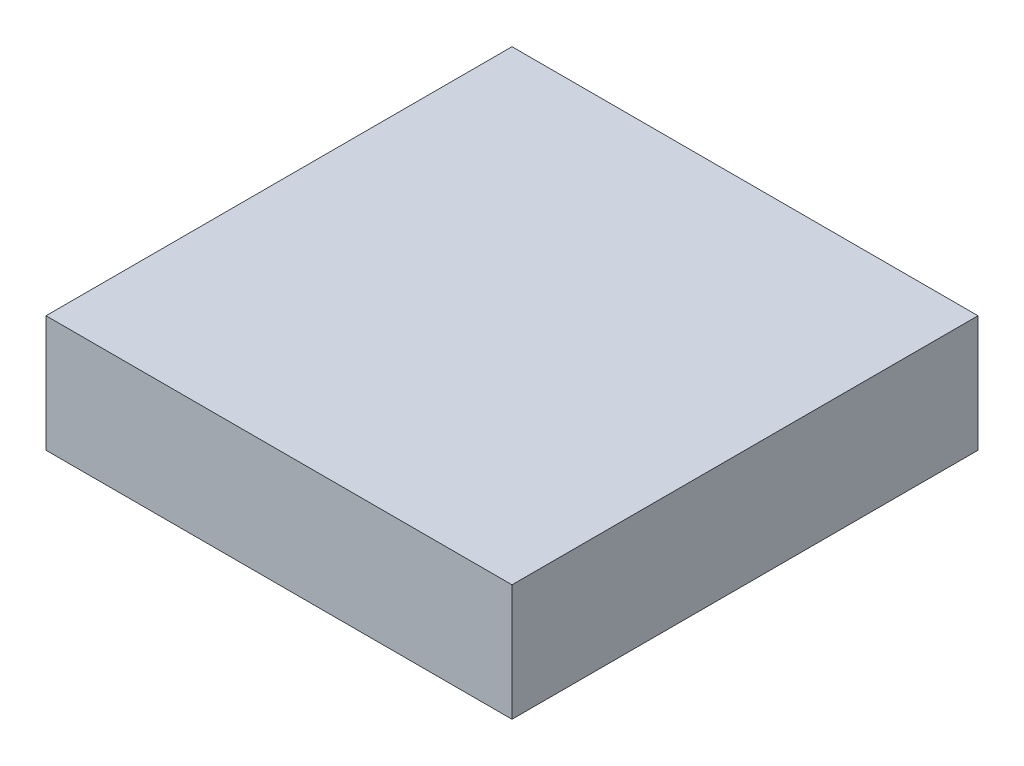
ISO-10303-21;
HEADER;
FILE_DESCRIPTION(('STEP AP214'),'2;1');
FILE_NAME('part.step','',(''),(''),'','','');
FILE_SCHEMA(('AUTOMOTIVE_DESIGN { 1 0 10303 214 1 1 1 1 }'));
ENDSEC;
DATA;
#1=APPLICATION_CONTEXT('core data for automotive mechanical design processes');
#2=APPLICATION_PROTOCOL_DEFINITION('international standard','automotive_design',2000,#1);
#3=PRODUCT_CONTEXT('',#1,'mechanical');
#4=PRODUCT('Part','Part','',(#3));
#5=PRODUCT_RELATED_PRODUCT_CATEGORY('part','',(#4));
#6=PRODUCT_DEFINITION_FORMATION('','',#4);
#7=PRODUCT_DEFINITION_CONTEXT('part definition',#1,'design');
#8=PRODUCT_DEFINITION('design','',#6,#7);
#9=PRODUCT_DEFINITION_SHAPE('','',#8);
#10=(LENGTH_UNIT() NAMED_UNIT(*) SI_UNIT(.MILLI.,.METRE.));
#11=(NAMED_UNIT(*) PLANE_ANGLE_UNIT() SI_UNIT($,.RADIAN.));
#12=(NAMED_UNIT(*) SI_UNIT($,.STERADIAN.) SOLID_ANGLE_UNIT());
#13=UNCERTAINTY_MEASURE_WITH_UNIT(LENGTH_MEASURE(1.E-05),#10,'distance_accuracy_value','');
#14=(GEOMETRIC_REPRESENTATION_CONTEXT(3) GLOBAL_UNCERTAINTY_ASSIGNED_CONTEXT((#13)) GLOBAL_UNIT_ASSIGNED_CONTEXT((#10,
#11,#12)) REPRESENTATION_CONTEXT('',''));
#15=CARTESIAN_POINT('',(0.,0.,0.));
#16=DIRECTION('',(0.,0.,1.));
#17=DIRECTION('',(1.,0.,0.));
#18=AXIS2_PLACEMENT_3D('',#15,#16,#17);
#19=CARTESIAN_POINT('',(0.,10.,0.));
#20=DIRECTION('',(1.,0.,0.));
#21=DIRECTION('',(0.,0.,-1.));
#22=AXIS2_PLACEMENT_3D('',#19,#20,#21);
#23=PLANE('',#22);
#24=DIRECTION('',(0.,0.,1.));
#25=VECTOR('',#24,1.);
#26=CARTESIAN_POINT('',(0.,0.,0.));
#27=LINE('',#26,#25);
#28=CARTESIAN_POINT('',(0.,0.,-40.));
#29=VERTEX_POINT('',#28);
#30=CARTESIAN_POINT('',(0.,0.,0.));
#31=VERTEX_POINT('',#30);
#32=EDGE_CURVE('E121',#29,#31,#27,.T.);
#33=ORIENTED_EDGE('',*,*,#32,.T.);
#34=DIRECTION('',(0.,-1.,0.));
#35=VECTOR('',#34,1.);
#36=CARTESIAN_POINT('',(0.,10.,0.));
#37=LINE('',#36,#35);
#38=CARTESIAN_POINT('',(0.,10.,0.));
#39=VERTEX_POINT('',#38);
#40=EDGE_CURVE('E11',#39,#31,#37,.T.);
#41=ORIENTED_EDGE('',*,*,#40,.F.);
#42=DIRECTION('',(0.,0.,1.));
#43=VECTOR('',#42,1.);
#44=CARTESIAN_POINT('',(0.,10.,0.));
#45=LINE('',#44,#43);
#46=CARTESIAN_POINT('',(0.,10.,-40.));
#47=VERTEX_POINT('',#46);
#48=EDGE_CURVE('E135',#47,#39,#45,.T.);
#49=ORIENTED_EDGE('',*,*,#48,.F.);
#50=DIRECTION('',(0.,-1.,0.));
#51=VECTOR('',#50,1.);
#52=CARTESIAN_POINT('',(0.,10.,-40.));
#53=LINE('',#52,#51);
#54=EDGE_CURVE('E141',#47,#29,#53,.T.);
#55=ORIENTED_EDGE('',*,*,#54,.T.);
#56=EDGE_LOOP('',(#33,#41,#49,#55));
#57=FACE_BOUND('',#56,.T.);
#58=ADVANCED_FACE('F39',(#57),#23,.F.);
#59=CARTESIAN_POINT('',(0.,10.,0.));
#60=DIRECTION('',(0.,0.,-1.));
#61=DIRECTION('',(-1.,0.,0.));
#62=AXIS2_PLACEMENT_3D('',#59,#60,#61);
#63=PLANE('',#62);
#64=DIRECTION('',(1.,0.,0.));
#65=VECTOR('',#64,1.);
#66=CARTESIAN_POINT('',(0.,0.,0.));
#67=LINE('',#66,#65);
#68=CARTESIAN_POINT('',(40.,0.,0.));
#69=VERTEX_POINT('',#68);
#70=EDGE_CURVE('E128',#31,#69,#67,.T.);
#71=ORIENTED_EDGE('',*,*,#70,.T.);
#72=DIRECTION('',(0.,-1.,0.));
#73=VECTOR('',#72,1.);
#74=CARTESIAN_POINT('',(40.,10.,0.));
#75=LINE('',#74,#73);
#76=CARTESIAN_POINT('',(40.,10.,0.));
#77=VERTEX_POINT('',#76);
#78=EDGE_CURVE('E46',#77,#69,#75,.T.);
#79=ORIENTED_EDGE('',*,*,#78,.F.);
#80=DIRECTION('',(1.,0.,0.));
#81=VECTOR('',#80,1.);
#82=CARTESIAN_POINT('',(0.,10.,0.));
#83=LINE('',#82,#81);
#84=EDGE_CURVE('E134',#39,#77,#83,.T.);
#85=ORIENTED_EDGE('',*,*,#84,.F.);
#86=ORIENTED_EDGE('',*,*,#40,.T.);
#87=EDGE_LOOP('',(#71,#79,#85,#86));
#88=FACE_BOUND('',#87,.T.);
#89=ADVANCED_FACE('F175',(#88),#63,.F.);
#90=CARTESIAN_POINT('',(40.,10.,0.));
#91=DIRECTION('',(-1.,0.,0.));
#92=DIRECTION('',(0.,0.,1.));
#93=AXIS2_PLACEMENT_3D('',#90,#91,#92);
#94=PLANE('',#93);
#95=DIRECTION('',(0.,0.,-1.));
#96=VECTOR('',#95,1.);
#97=CARTESIAN_POINT('',(40.,0.,0.));
#98=LINE('',#97,#96);
#99=CARTESIAN_POINT('',(40.,0.,-40.));
#100=VERTEX_POINT('',#99);
#101=EDGE_CURVE('E143',#69,#100,#98,.T.);
#102=ORIENTED_EDGE('',*,*,#101,.T.);
#103=DIRECTION('',(0.,-1.,0.));
#104=VECTOR('',#103,1.);
#105=CARTESIAN_POINT('',(40.,10.,-40.));
#106=LINE('',#105,#104);
#107=CARTESIAN_POINT('',(40.,10.,-40.));
#108=VERTEX_POINT('',#107);
#109=EDGE_CURVE('E146',#108,#100,#106,.T.);
#110=ORIENTED_EDGE('',*,*,#109,.F.);
#111=DIRECTION('',(0.,0.,-1.));
#112=VECTOR('',#111,1.);
#113=CARTESIAN_POINT('',(40.,10.,0.));
#114=LINE('',#113,#112);
#115=EDGE_CURVE('E138',#77,#108,#114,.T.);
#116=ORIENTED_EDGE('',*,*,#115,.F.);
#117=ORIENTED_EDGE('',*,*,#78,.T.);
#118=EDGE_LOOP('',(#102,#110,#116,#117));
#119=FACE_BOUND('',#118,.T.);
#120=ADVANCED_FACE('F157',(#119),#94,.F.);
#121=CARTESIAN_POINT('',(0.,10.,-40.));
#122=DIRECTION('',(0.,0.,1.));
#123=DIRECTION('',(1.,0.,0.));
#124=AXIS2_PLACEMENT_3D('',#121,#122,#123);
#125=PLANE('',#124);
#126=DIRECTION('',(-1.,0.,0.));
#127=VECTOR('',#126,1.);
#128=CARTESIAN_POINT('',(0.,0.,-40.));
#129=LINE('',#128,#127);
#130=EDGE_CURVE('E136',#100,#29,#129,.T.);
#131=ORIENTED_EDGE('',*,*,#130,.T.);
#132=ORIENTED_EDGE('',*,*,#54,.F.);
#133=DIRECTION('',(-1.,0.,0.));
#134=VECTOR('',#133,1.);
#135=CARTESIAN_POINT('',(0.,10.,-40.));
#136=LINE('',#135,#134);
#137=EDGE_CURVE('E139',#108,#47,#136,.T.);
#138=ORIENTED_EDGE('',*,*,#137,.F.);
#139=ORIENTED_EDGE('',*,*,#109,.T.);
#140=EDGE_LOOP('',(#131,#132,#138,#139));
#141=FACE_BOUND('',#140,.T.);
#142=ADVANCED_FACE('F163',(#141),#125,.F.);
#143=CARTESIAN_POINT('',(0.,10.,0.));
#144=DIRECTION('',(0.,-1.,0.));
#145=DIRECTION('',(0.,0.,-1.));
#146=AXIS2_PLACEMENT_3D('',#143,#144,#145);
#147=PLANE('',#146);
#148=ORIENTED_EDGE('',*,*,#48,.T.);
#149=ORIENTED_EDGE('',*,*,#84,.T.);
#150=ORIENTED_EDGE('',*,*,#115,.T.);
#151=ORIENTED_EDGE('',*,*,#137,.T.);
#152=EDGE_LOOP('',(#148,#149,#150,#151));
#153=FACE_BOUND('',#152,.T.);
#154=ADVANCED_FACE('F173',(#153),#147,.F.);
#155=CARTESIAN_POINT('',(0.,0.,0.));
#156=DIRECTION('',(0.,-1.,0.));
#157=DIRECTION('',(0.,0.,-1.));
#158=AXIS2_PLACEMENT_3D('',#155,#156,#157);
#159=PLANE('',#158);
#160=DIRECTION('',(0.,0.,1.));
#161=VECTOR('',#160,1.);
#162=CARTESIAN_POINT('',(25.5,0.,-25.5));
#163=LINE('',#162,#161);
#164=CARTESIAN_POINT('',(25.5,0.,-25.5));
#165=VERTEX_POINT('',#164);
#166=CARTESIAN_POINT('',(25.5,0.,-14.5));
#167=VERTEX_POINT('',#166);
#168=EDGE_CURVE('E52',#165,#167,#163,.T.);
#169=ORIENTED_EDGE('',*,*,#168,.F.);
#170=DIRECTION('',(1.,0.,0.));
#171=VECTOR('',#170,1.);
#172=CARTESIAN_POINT('',(14.5,0.,-25.5));
#173=LINE('',#172,#171);
#174=CARTESIAN_POINT('',(14.5,0.,-25.5));
#175=VERTEX_POINT('',#174);
#176=EDGE_CURVE('E60',#175,#165,#173,.T.);
#177=ORIENTED_EDGE('',*,*,#176,.F.);
#178=DIRECTION('',(0.,0.,-1.));
#179=VECTOR('',#178,1.);
#180=CARTESIAN_POINT('',(14.5,0.,-25.5));
#181=LINE('',#180,#179);
#182=CARTESIAN_POINT('',(14.5,0.,-14.5));
#183=VERTEX_POINT('',#182);
#184=EDGE_CURVE('E266',#183,#175,#181,.T.);
#185=ORIENTED_EDGE('',*,*,#184,.F.);
#186=DIRECTION('',(-1.,0.,0.));
#187=VECTOR('',#186,1.);
#188=CARTESIAN_POINT('',(14.5,0.,-14.5));
#189=LINE('',#188,#187);
#190=EDGE_CURVE('E275',#167,#183,#189,.T.);
#191=ORIENTED_EDGE('',*,*,#190,.F.);
#192=EDGE_LOOP('',(#169,#177,#185,#191));
#193=FACE_BOUND('',#192,.T.);
#194=ORIENTED_EDGE('',*,*,#32,.F.);
#195=ORIENTED_EDGE('',*,*,#130,.F.);
#196=ORIENTED_EDGE('',*,*,#101,.F.);
#197=ORIENTED_EDGE('',*,*,#70,.F.);
#198=EDGE_LOOP('',(#194,#195,#196,#197));
#199=FACE_BOUND('',#198,.T.);
#200=ADVANCED_FACE('F164',(#193,#199),#159,.T.);
#201=CARTESIAN_POINT('',(25.5,-0.5,-25.5));
#202=DIRECTION('',(-1.,0.,0.));
#203=DIRECTION('',(0.,0.,1.));
#204=AXIS2_PLACEMENT_3D('',#201,#202,#203);
#205=PLANE('',#204);
#206=ORIENTED_EDGE('',*,*,#168,.T.);
#207=DIRECTION('',(0.,1.,0.));
#208=VECTOR('',#207,1.);
#209=CARTESIAN_POINT('',(25.5,-0.5,-14.5));
#210=LINE('',#209,#208);
#211=CARTESIAN_POINT('',(25.5,-0.5,-14.5));
#212=VERTEX_POINT('',#211);
#213=EDGE_CURVE('E107',#212,#167,#210,.T.);
#214=ORIENTED_EDGE('',*,*,#213,.F.);
#215=DIRECTION('',(0.,0.,1.));
#216=VECTOR('',#215,1.);
#217=CARTESIAN_POINT('',(25.5,-0.5,-25.5));
#218=LINE('',#217,#216);
#219=CARTESIAN_POINT('',(25.5,-0.5,-25.5));
#220=VERTEX_POINT('',#219);
#221=EDGE_CURVE('E115',#220,#212,#218,.T.);
#222=ORIENTED_EDGE('',*,*,#221,.F.);
#223=DIRECTION('',(0.,1.,0.));
#224=VECTOR('',#223,1.);
#225=CARTESIAN_POINT('',(25.5,-0.5,-25.5));
#226=LINE('',#225,#224);
#227=EDGE_CURVE('E264',#220,#165,#226,.T.);
#228=ORIENTED_EDGE('',*,*,#227,.T.);
#229=EDGE_LOOP('',(#206,#214,#222,#228));
#230=FACE_BOUND('',#229,.T.);
#231=ADVANCED_FACE('F122',(#230),#205,.F.);
#232=CARTESIAN_POINT('',(14.5,-0.5,-14.5));
#233=DIRECTION('',(0.,0.,-1.));
#234=DIRECTION('',(-1.,0.,0.));
#235=AXIS2_PLACEMENT_3D('',#232,#233,#234);
#236=PLANE('',#235);
#237=ORIENTED_EDGE('',*,*,#190,.T.);
#238=DIRECTION('',(0.,1.,0.));
#239=VECTOR('',#238,1.);
#240=CARTESIAN_POINT('',(14.5,-0.5,-14.5));
#241=LINE('',#240,#239);
#242=CARTESIAN_POINT('',(14.5,-0.5,-14.5));
#243=VERTEX_POINT('',#242);
#244=EDGE_CURVE('E110',#243,#183,#241,.T.);
#245=ORIENTED_EDGE('',*,*,#244,.F.);
#246=DIRECTION('',(-1.,0.,0.));
#247=VECTOR('',#246,1.);
#248=CARTESIAN_POINT('',(14.5,-0.5,-14.5));
#249=LINE('',#248,#247);
#250=EDGE_CURVE('E102',#212,#243,#249,.T.);
#251=ORIENTED_EDGE('',*,*,#250,.F.);
#252=ORIENTED_EDGE('',*,*,#213,.T.);
#253=EDGE_LOOP('',(#237,#245,#251,#252));
#254=FACE_BOUND('',#253,.T.);
#255=ADVANCED_FACE('F101',(#254),#236,.F.);
#256=CARTESIAN_POINT('',(14.5,-0.5,-25.5));
#257=DIRECTION('',(1.,0.,0.));
#258=DIRECTION('',(0.,0.,-1.));
#259=AXIS2_PLACEMENT_3D('',#256,#257,#258);
#260=PLANE('',#259);
#261=ORIENTED_EDGE('',*,*,#184,.T.);
#262=DIRECTION('',(0.,1.,0.));
#263=VECTOR('',#262,1.);
#264=CARTESIAN_POINT('',(14.5,-0.5,-25.5));
#265=LINE('',#264,#263);
#266=CARTESIAN_POINT('',(14.5,-0.5,-25.5));
#267=VERTEX_POINT('',#266);
#268=EDGE_CURVE('E126',#267,#175,#265,.T.);
#269=ORIENTED_EDGE('',*,*,#268,.F.);
#270=DIRECTION('',(0.,0.,-1.));
#271=VECTOR('',#270,1.);
#272=CARTESIAN_POINT('',(14.5,-0.5,-25.5));
#273=LINE('',#272,#271);
#274=EDGE_CURVE('E112',#243,#267,#273,.T.);
#275=ORIENTED_EDGE('',*,*,#274,.F.);
#276=ORIENTED_EDGE('',*,*,#244,.T.);
#277=EDGE_LOOP('',(#261,#269,#275,#276));
#278=FACE_BOUND('',#277,.T.);
#279=ADVANCED_FACE('F189',(#278),#260,.F.);
#280=CARTESIAN_POINT('',(14.5,-0.5,-25.5));
#281=DIRECTION('',(0.,0.,1.));
#282=DIRECTION('',(1.,0.,0.));
#283=AXIS2_PLACEMENT_3D('',#280,#281,#282);
#284=PLANE('',#283);
#285=ORIENTED_EDGE('',*,*,#176,.T.);
#286=ORIENTED_EDGE('',*,*,#227,.F.);
#287=DIRECTION('',(1.,0.,0.));
#288=VECTOR('',#287,1.);
#289=CARTESIAN_POINT('',(14.5,-0.5,-25.5));
#290=LINE('',#289,#288);
#291=EDGE_CURVE('E119',#267,#220,#290,.T.);
#292=ORIENTED_EDGE('',*,*,#291,.F.);
#293=ORIENTED_EDGE('',*,*,#268,.T.);
#294=EDGE_LOOP('',(#285,#286,#292,#293));
#295=FACE_BOUND('',#294,.T.);
#296=ADVANCED_FACE('F194',(#295),#284,.F.);
#297=CARTESIAN_POINT('',(0.,-0.5,0.));
#298=DIRECTION('',(0.,1.,0.));
#299=DIRECTION('',(0.,0.,1.));
#300=AXIS2_PLACEMENT_3D('',#297,#298,#299);
#301=PLANE('',#300);
#302=ORIENTED_EDGE('',*,*,#221,.T.);
#303=ORIENTED_EDGE('',*,*,#250,.T.);
#304=ORIENTED_EDGE('',*,*,#274,.T.);
#305=ORIENTED_EDGE('',*,*,#291,.T.);
#306=EDGE_LOOP('',(#302,#303,#304,#305));
#307=FACE_BOUND('',#306,.T.);
#308=ADVANCED_FACE('F113',(#307),#301,.F.);
#309=CLOSED_SHELL('',(#58,#89,#120,#142,#154,#200,#231,#255,#279,#296,#308));
#310=MANIFOLD_SOLID_BREP('B2',#309);
#311=ADVANCED_BREP_SHAPE_REPRESENTATION('',(#18,#310),#14);
#312=SHAPE_DEFINITION_REPRESENTATION(#9,#311);
ENDSEC;
END-ISO-10303-21;
